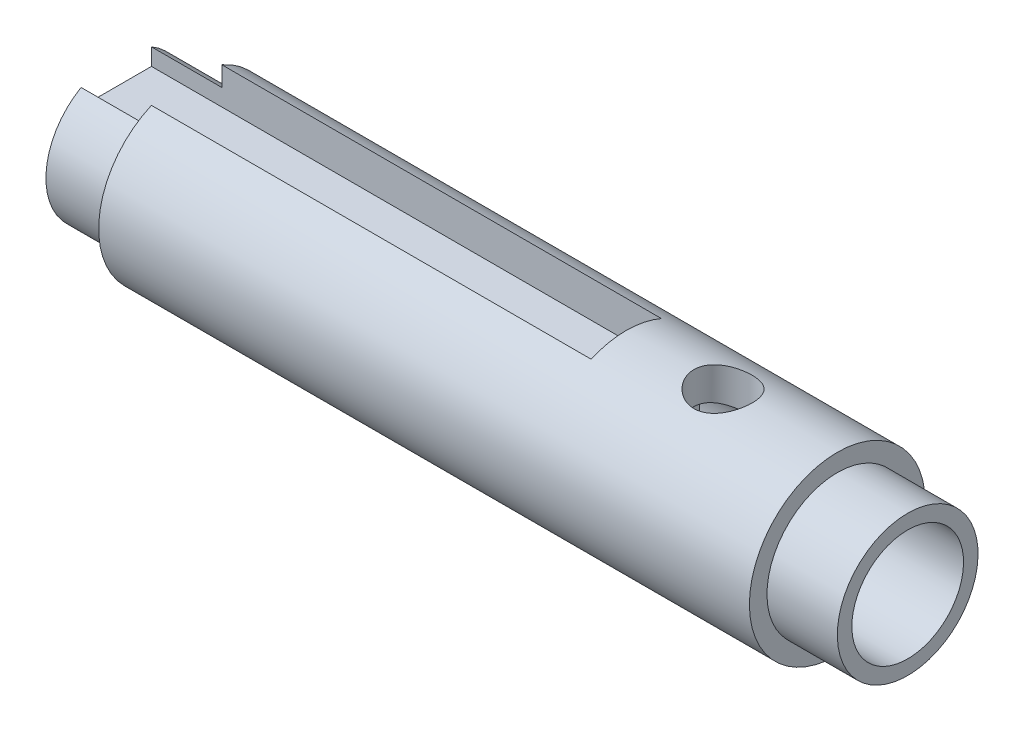
ISO-10303-21;
HEADER;
FILE_DESCRIPTION(('STEP AP214'),'2;1');
FILE_NAME('part.step','',(''),(''),'','','');
FILE_SCHEMA(('AUTOMOTIVE_DESIGN { 1 0 10303 214 1 1 1 1 }'));
ENDSEC;
DATA;
#1=APPLICATION_CONTEXT('core data for automotive mechanical design processes');
#2=APPLICATION_PROTOCOL_DEFINITION('international standard','automotive_design',2000,#1);
#3=PRODUCT_CONTEXT('',#1,'mechanical');
#4=PRODUCT('Part','Part','',(#3));
#5=PRODUCT_RELATED_PRODUCT_CATEGORY('part','',(#4));
#6=PRODUCT_DEFINITION_FORMATION('','',#4);
#7=PRODUCT_DEFINITION_CONTEXT('part definition',#1,'design');
#8=PRODUCT_DEFINITION('design','',#6,#7);
#9=PRODUCT_DEFINITION_SHAPE('','',#8);
#10=(LENGTH_UNIT() NAMED_UNIT(*) SI_UNIT(.MILLI.,.METRE.));
#11=(NAMED_UNIT(*) PLANE_ANGLE_UNIT() SI_UNIT($,.RADIAN.));
#12=(NAMED_UNIT(*) SI_UNIT($,.STERADIAN.) SOLID_ANGLE_UNIT());
#13=UNCERTAINTY_MEASURE_WITH_UNIT(LENGTH_MEASURE(1.E-05),#10,'distance_accuracy_value','');
#14=(GEOMETRIC_REPRESENTATION_CONTEXT(3) GLOBAL_UNCERTAINTY_ASSIGNED_CONTEXT((#13)) GLOBAL_UNIT_ASSIGNED_CONTEXT((#10,
#11,#12)) REPRESENTATION_CONTEXT('',''));
#15=CARTESIAN_POINT('',(0.,0.,0.));
#16=DIRECTION('',(0.,0.,1.));
#17=DIRECTION('',(1.,0.,0.));
#18=AXIS2_PLACEMENT_3D('',#15,#16,#17);
#19=CARTESIAN_POINT('',(22.5,0.,0.));
#20=DIRECTION('',(1.,0.,0.));
#21=DIRECTION('',(0.,1.,0.));
#22=AXIS2_PLACEMENT_3D('',#19,#20,#21);
#23=CYLINDRICAL_SURFACE('',#22,4.);
#24=CARTESIAN_POINT('',(18.5,0.,0.));
#25=DIRECTION('',(-1.,0.,0.));
#26=DIRECTION('',(0.,1.,0.));
#27=AXIS2_PLACEMENT_3D('',#24,#25,#26);
#28=CIRCLE('',#27,4.);
#29=CARTESIAN_POINT('',(18.5,4.00000000000001,0.));
#30=VERTEX_POINT('',#29);
#31=EDGE_CURVE('E196',#30,#30,#28,.T.);
#32=ORIENTED_EDGE('',*,*,#31,.F.);
#33=EDGE_LOOP('',(#32));
#34=FACE_BOUND('',#33,.T.);
#35=CARTESIAN_POINT('',(22.5,0.,0.));
#36=DIRECTION('',(-1.,0.,0.));
#37=DIRECTION('',(0.,1.,0.));
#38=AXIS2_PLACEMENT_3D('',#35,#36,#37);
#39=CIRCLE('',#38,4.);
#40=CARTESIAN_POINT('',(22.5,4.00000000000001,0.));
#41=VERTEX_POINT('',#40);
#42=EDGE_CURVE('E179',#41,#41,#39,.T.);
#43=ORIENTED_EDGE('',*,*,#42,.T.);
#44=EDGE_LOOP('',(#43));
#45=FACE_BOUND('',#44,.T.);
#46=ADVANCED_FACE('F42',(#34,#45),#23,.T.);
#47=CARTESIAN_POINT('',(22.5,0.,0.));
#48=DIRECTION('',(1.,0.,0.));
#49=DIRECTION('',(0.,1.,0.));
#50=AXIS2_PLACEMENT_3D('',#47,#48,#49);
#51=PLANE('',#50);
#52=CARTESIAN_POINT('',(22.5,0.,0.));
#53=DIRECTION('',(-1.,0.,0.));
#54=DIRECTION('',(0.,1.,0.));
#55=AXIS2_PLACEMENT_3D('',#52,#53,#54);
#56=CIRCLE('',#55,3.175);
#57=CARTESIAN_POINT('',(22.5,3.17500000000001,0.));
#58=VERTEX_POINT('',#57);
#59=EDGE_CURVE('E151',#58,#58,#56,.T.);
#60=ORIENTED_EDGE('',*,*,#59,.T.);
#61=EDGE_LOOP('',(#60));
#62=FACE_BOUND('',#61,.T.);
#63=ORIENTED_EDGE('',*,*,#42,.F.);
#64=EDGE_LOOP('',(#63));
#65=FACE_BOUND('',#64,.T.);
#66=ADVANCED_FACE('F214',(#62,#65),#51,.T.);
#67=CARTESIAN_POINT('',(-22.5,0.,0.));
#68=DIRECTION('',(-1.,0.,0.));
#69=DIRECTION('',(0.,-1.,0.));
#70=AXIS2_PLACEMENT_3D('',#67,#68,#69);
#71=PLANE('',#70);
#72=DIRECTION('',(0.,1.,0.));
#73=VECTOR('',#72,1.);
#74=CARTESIAN_POINT('',(-22.5,0.,-2.));
#75=LINE('',#74,#73);
#76=CARTESIAN_POINT('',(-22.5,2.49999999999999,-2.));
#77=VERTEX_POINT('',#76);
#78=CARTESIAN_POINT('',(-22.5,3.46410161513775,-2.));
#79=VERTEX_POINT('',#78);
#80=EDGE_CURVE('E139',#77,#79,#75,.T.);
#81=ORIENTED_EDGE('',*,*,#80,.T.);
#82=CARTESIAN_POINT('',(-22.5,0.,0.));
#83=DIRECTION('',(-1.,0.,0.));
#84=DIRECTION('',(0.,1.,0.));
#85=AXIS2_PLACEMENT_3D('',#82,#83,#84);
#86=CIRCLE('',#85,4.);
#87=CARTESIAN_POINT('',(-22.5,3.46410161513775,2.));
#88=VERTEX_POINT('',#87);
#89=EDGE_CURVE('E185',#79,#88,#86,.T.);
#90=ORIENTED_EDGE('',*,*,#89,.T.);
#91=DIRECTION('',(0.,1.,0.));
#92=VECTOR('',#91,1.);
#93=CARTESIAN_POINT('',(-22.5,0.,2.));
#94=LINE('',#93,#92);
#95=CARTESIAN_POINT('',(-22.5,2.49999999999999,2.));
#96=VERTEX_POINT('',#95);
#97=EDGE_CURVE('E127',#96,#88,#94,.T.);
#98=ORIENTED_EDGE('',*,*,#97,.F.);
#99=DIRECTION('',(0.,0.,-1.));
#100=VECTOR('',#99,1.);
#101=CARTESIAN_POINT('',(-22.5,2.49999999999999,0.));
#102=LINE('',#101,#100);
#103=EDGE_CURVE('E12',#96,#77,#102,.T.);
#104=ORIENTED_EDGE('',*,*,#103,.T.);
#105=EDGE_LOOP('',(#81,#90,#98,#104));
#106=FACE_BOUND('',#105,.T.);
#107=ADVANCED_FACE('F219',(#106),#71,.T.);
#108=CARTESIAN_POINT('',(22.5,0.,0.));
#109=DIRECTION('',(1.,0.,0.));
#110=DIRECTION('',(0.,1.,0.));
#111=AXIS2_PLACEMENT_3D('',#108,#109,#110);
#112=CYLINDRICAL_SURFACE('',#111,4.);
#113=DIRECTION('',(1.,0.,0.));
#114=VECTOR('',#113,1.);
#115=CARTESIAN_POINT('',(22.5,3.46410161513776,-2.));
#116=LINE('',#115,#114);
#117=CARTESIAN_POINT('',(-18.5,3.46410161513775,-2.));
#118=VERTEX_POINT('',#117);
#119=EDGE_CURVE('E62',#79,#118,#116,.T.);
#120=ORIENTED_EDGE('',*,*,#119,.T.);
#121=CARTESIAN_POINT('',(-18.5,0.,0.));
#122=DIRECTION('',(-1.,0.,0.));
#123=DIRECTION('',(0.,1.,0.));
#124=AXIS2_PLACEMENT_3D('',#121,#122,#123);
#125=CIRCLE('',#124,4.);
#126=CARTESIAN_POINT('',(-18.5,3.46410161513775,2.));
#127=VERTEX_POINT('',#126);
#128=EDGE_CURVE('E189',#118,#127,#125,.T.);
#129=ORIENTED_EDGE('',*,*,#128,.T.);
#130=DIRECTION('',(1.,0.,0.));
#131=VECTOR('',#130,1.);
#132=CARTESIAN_POINT('',(22.5,3.46410161513776,2.));
#133=LINE('',#132,#131);
#134=EDGE_CURVE('E124',#88,#127,#133,.T.);
#135=ORIENTED_EDGE('',*,*,#134,.F.);
#136=ORIENTED_EDGE('',*,*,#89,.F.);
#137=EDGE_LOOP('',(#120,#129,#135,#136));
#138=FACE_BOUND('',#137,.T.);
#139=ADVANCED_FACE('F229',(#138),#112,.T.);
#140=CARTESIAN_POINT('',(-18.5,3.99999999999999,0.));
#141=DIRECTION('',(-1.,0.,0.));
#142=DIRECTION('',(0.,-1.,0.));
#143=AXIS2_PLACEMENT_3D('',#140,#141,#142);
#144=PLANE('',#143);
#145=DIRECTION('',(0.,1.,0.));
#146=VECTOR('',#145,1.);
#147=CARTESIAN_POINT('',(-18.5,3.99999999999999,-2.));
#148=LINE('',#147,#146);
#149=CARTESIAN_POINT('',(-18.5,4.58257569495583,-2.));
#150=VERTEX_POINT('',#149);
#151=EDGE_CURVE('E140',#118,#150,#148,.T.);
#152=ORIENTED_EDGE('',*,*,#151,.T.);
#153=CARTESIAN_POINT('',(-18.5,0.,0.));
#154=DIRECTION('',(-1.,0.,0.));
#155=DIRECTION('',(0.,1.,0.));
#156=AXIS2_PLACEMENT_3D('',#153,#154,#155);
#157=CIRCLE('',#156,5.);
#158=CARTESIAN_POINT('',(-18.5,4.58257569495583,2.));
#159=VERTEX_POINT('',#158);
#160=EDGE_CURVE('E191',#150,#159,#157,.T.);
#161=ORIENTED_EDGE('',*,*,#160,.T.);
#162=DIRECTION('',(0.,1.,0.));
#163=VECTOR('',#162,1.);
#164=CARTESIAN_POINT('',(-18.5,3.99999999999999,2.));
#165=LINE('',#164,#163);
#166=EDGE_CURVE('E107',#127,#159,#165,.T.);
#167=ORIENTED_EDGE('',*,*,#166,.F.);
#168=ORIENTED_EDGE('',*,*,#128,.F.);
#169=EDGE_LOOP('',(#152,#161,#167,#168));
#170=FACE_BOUND('',#169,.T.);
#171=ADVANCED_FACE('F171',(#170),#144,.T.);
#172=CARTESIAN_POINT('',(22.5,0.,0.));
#173=DIRECTION('',(1.,0.,0.));
#174=DIRECTION('',(0.,1.,0.));
#175=AXIS2_PLACEMENT_3D('',#172,#173,#174);
#176=CYLINDRICAL_SURFACE('',#175,5.);
#177=DIRECTION('',(1.,0.,0.));
#178=VECTOR('',#177,1.);
#179=CARTESIAN_POINT('',(22.5,4.58257569495585,-2.));
#180=LINE('',#179,#178);
#181=CARTESIAN_POINT('',(6.5,4.58257569495584,-2.));
#182=VERTEX_POINT('',#181);
#183=EDGE_CURVE('E48',#150,#182,#180,.T.);
#184=ORIENTED_EDGE('',*,*,#183,.T.);
#185=CARTESIAN_POINT('',(6.5,0.,0.));
#186=DIRECTION('',(1.,0.,0.));
#187=DIRECTION('',(0.,-1.,0.));
#188=AXIS2_PLACEMENT_3D('',#185,#186,#187);
#189=CIRCLE('',#188,5.);
#190=CARTESIAN_POINT('',(6.5,4.58257569495584,2.));
#191=VERTEX_POINT('',#190);
#192=EDGE_CURVE('E97',#182,#191,#189,.T.);
#193=ORIENTED_EDGE('',*,*,#192,.T.);
#194=DIRECTION('',(1.,0.,0.));
#195=VECTOR('',#194,1.);
#196=CARTESIAN_POINT('',(22.5,4.58257569495585,2.));
#197=LINE('',#196,#195);
#198=EDGE_CURVE('E104',#159,#191,#197,.T.);
#199=ORIENTED_EDGE('',*,*,#198,.F.);
#200=ORIENTED_EDGE('',*,*,#160,.F.);
#201=EDGE_LOOP('',(#184,#193,#199,#200));
#202=FACE_BOUND('',#201,.T.);
#203=CARTESIAN_POINT('',(10.35,5.,0.));
#204=CARTESIAN_POINT('',(10.3499997574856,5.00000012564882,-0.0900803323989867));
#205=CARTESIAN_POINT('',(10.357400837485,4.99754312617874,-0.180159574077353));
#206=CARTESIAN_POINT('',(10.3867211495276,4.98798348171153,-0.357667875169257));
#207=CARTESIAN_POINT('',(10.4086421758353,4.98088026257135,-0.44509660565632));
#208=CARTESIAN_POINT('',(10.4661713123883,4.96280068143201,-0.614719075952392));
#209=CARTESIAN_POINT('',(10.501756817014,4.95183071876684,-0.696921201899964));
#210=CARTESIAN_POINT('',(10.5855035726919,4.92713947248839,-0.854190645874481));
#211=CARTESIAN_POINT('',(10.6336672263034,4.91341766335966,-0.929256597076052));
#212=CARTESIAN_POINT('',(10.7429248230714,4.88414667976015,-1.07267700256014));
#213=CARTESIAN_POINT('',(10.8043700182742,4.86855436886588,-1.140755021368));
#214=CARTESIAN_POINT('',(10.9376995139198,4.83753907804007,-1.26585047260417));
#215=CARTESIAN_POINT('',(11.0095860466927,4.8221161350793,-1.32286553369749));
#216=CARTESIAN_POINT('',(11.1642306123795,4.79271313173334,-1.42578155512387));
#217=CARTESIAN_POINT('',(11.2472372375852,4.77878574898836,-1.47132547146369));
#218=CARTESIAN_POINT('',(11.4202656308341,4.75460549483772,-1.5476895000705));
#219=CARTESIAN_POINT('',(11.5102852973523,4.74435152777497,-1.57851400356115));
#220=CARTESIAN_POINT('',(11.6916448290813,4.72913282635101,-1.62353134991423));
#221=CARTESIAN_POINT('',(11.7828421633256,4.72400412235767,-1.6382413417332));
#222=CARTESIAN_POINT('',(11.966543612694,4.7191313464795,-1.65222861163855));
#223=CARTESIAN_POINT('',(12.0590473250677,4.71938564975367,-1.65151054662635));
#224=CARTESIAN_POINT('',(12.2383472023923,4.72510629107569,-1.63506410098719));
#225=CARTESIAN_POINT('',(12.3252137352388,4.73033928879682,-1.62000769651632));
#226=CARTESIAN_POINT('',(12.4951109061667,4.74504632523488,-1.57640708934977));
#227=CARTESIAN_POINT('',(12.5781410922653,4.75452086227439,-1.54786130181506));
#228=CARTESIAN_POINT('',(12.7395474399946,4.77681173941001,-1.47764674240872));
#229=CARTESIAN_POINT('',(12.8178288502253,4.78967871947684,-1.43577693123635));
#230=CARTESIAN_POINT('',(12.9664683623015,4.81728315916033,-1.34024242388314));
#231=CARTESIAN_POINT('',(13.0368242036941,4.83202114987191,-1.28657437554158));
#232=CARTESIAN_POINT('',(13.1713952274102,4.86262798242567,-1.16572801734404));
#233=CARTESIAN_POINT('',(13.2351128786431,4.87851612594017,-1.09799945388895));
#234=CARTESIAN_POINT('',(13.3504141782392,4.9089733458653,-0.952622363558083));
#235=CARTESIAN_POINT('',(13.401996708755,4.92354230068064,-0.874972923819716));
#236=CARTESIAN_POINT('',(13.491953516837,4.9499042925994,-0.710918878360193));
#237=CARTESIAN_POINT('',(13.530196897213,4.96166947936115,-0.624437715003006));
#238=CARTESIAN_POINT('',(13.5914397196063,4.98089634514735,-0.445788820584336));
#239=CARTESIAN_POINT('',(13.6144443470641,4.98835948795835,-0.353623035566634));
#240=CARTESIAN_POINT('',(13.6436807853833,4.9979000192954,-0.17043493694281));
#241=CARTESIAN_POINT('',(13.6505850936395,5.0001932084094,-0.0795310449403316));
#242=CARTESIAN_POINT('',(13.6493373673087,4.99978120399321,0.10215299707419));
#243=CARTESIAN_POINT('',(13.6411878171332,4.99707683523428,0.19293316503069));
#244=CARTESIAN_POINT('',(13.6105971738171,4.98711592890817,0.369117276094976));
#245=CARTESIAN_POINT('',(13.5885667899855,4.97999029806496,0.454600657078433));
#246=CARTESIAN_POINT('',(13.5313513084882,4.96203610216641,0.620625393385987));
#247=CARTESIAN_POINT('',(13.4961645401181,4.9512070668376,0.701166119538831));
#248=CARTESIAN_POINT('',(13.4126189804476,4.92659738190257,0.857353583850655));
#249=CARTESIAN_POINT('',(13.3639413852355,4.91274728599484,0.932818538636807));
#250=CARTESIAN_POINT('',(13.2551717652041,4.8836680633903,1.07472879779132));
#251=CARTESIAN_POINT('',(13.195076316326,4.86843852373584,1.14117138619964));
#252=CARTESIAN_POINT('',(13.062013827308,4.83745909847492,1.26622547851876));
#253=CARTESIAN_POINT('',(12.9885931330763,4.82171620160003,1.32435715949936));
#254=CARTESIAN_POINT('',(12.8327001451063,4.79218567046633,1.42753142742357));
#255=CARTESIAN_POINT('',(12.7502278168408,4.77839804366633,1.47257396443646));
#256=CARTESIAN_POINT('',(12.5785745160417,4.75447746870334,1.54806908435207));
#257=CARTESIAN_POINT('',(12.4894100140228,4.74433588191366,1.57855621066784));
#258=CARTESIAN_POINT('',(12.3068020979204,4.728992662468,1.62395003915295));
#259=CARTESIAN_POINT('',(12.213360579788,4.72378886275909,1.63886357641239));
#260=CARTESIAN_POINT('',(12.0299145750871,4.71915352744858,1.65216049477083));
#261=CARTESIAN_POINT('',(11.9399740636218,4.71944442417867,1.6513387236508));
#262=CARTESIAN_POINT('',(11.7615834004099,4.72508139490563,1.63513842564513));
#263=CARTESIAN_POINT('',(11.6731331635849,4.7304271793221,1.61976073262755));
#264=CARTESIAN_POINT('',(11.5018358628154,4.74536693764462,1.57544291875231));
#265=CARTESIAN_POINT('',(11.4189160278425,4.75488165289365,1.54675527092969));
#266=CARTESIAN_POINT('',(11.2590025073374,4.77705935615134,1.47683540940045));
#267=CARTESIAN_POINT('',(11.1820101250481,4.78972303393434,1.43560044678476));
#268=CARTESIAN_POINT('',(11.0325565456336,4.81744939348764,1.33969084183065));
#269=CARTESIAN_POINT('',(10.9604315889302,4.8325917044349,1.28451538865981));
#270=CARTESIAN_POINT('',(10.826207419325,4.86323043063064,1.16314331347536));
#271=CARTESIAN_POINT('',(10.7641110248733,4.87872694403302,1.09694360376003));
#272=CARTESIAN_POINT('',(10.6493366681908,4.90903317548774,0.952387676734107));
#273=CARTESIAN_POINT('',(10.5971049783148,4.92379458911327,0.873665758138171));
#274=CARTESIAN_POINT('',(10.5066751421022,4.95031750248797,0.708077082051268));
#275=CARTESIAN_POINT('',(10.4684730828886,4.96207983840249,0.621212604024479));
#276=CARTESIAN_POINT('',(10.4089869849695,4.98076953032462,0.446386541872211));
#277=CARTESIAN_POINT('',(10.386936477516,4.98791371763215,0.358709155083951));
#278=CARTESIAN_POINT('',(10.3574450279568,4.99752827480817,0.180687007883427));
#279=CARTESIAN_POINT('',(10.3500002432214,4.99999987398486,0.0903429553968472));
#280=CARTESIAN_POINT('',(10.35,5.,0.));
#281=B_SPLINE_CURVE_WITH_KNOTS('',3,(#203,#204,#205,#206,#207,#208,#209,#210,#211,#212,#213,
#214,#215,#216,#217,#218,#219,#220,#221,#222,#223,#224,#225,#226,#227,#228,#229,#230,#231,#232,
#233,#234,#235,#236,#237,#238,#239,#240,#241,#242,#243,#244,#245,#246,#247,#248,#249,#250,#251,
#252,#253,#254,#255,#256,#257,#258,#259,#260,#261,#262,#263,#264,#265,#266,#267,#268,#269,#270,
#271,#272,#273,#274,#275,#276,#277,#278,#279,#280),.UNSPECIFIED.,.T.,.F.,(4,2,2,2,2,2,2,2,2,2,2,
2,2,2,2,2,2,2,2,2,2,2,2,2,2,2,2,2,2,2,2,2,2,2,2,2,2,2,4),(0.,0.269908604132499,
0.539850567737246,0.809347867689092,1.07889668217443,1.35671215765951,1.63458711701568,
1.92026489148116,2.20585738673401,2.48198869358466,2.75803665240172,3.02175295330503,
3.28550024538371,3.55343249441285,3.82144096800203,4.10314526837294,4.38487550826385,
4.66929734218007,4.95362234329173,5.22584041060145,5.49801355645391,5.76248915124946,
6.02699834271653,6.29838751507403,6.56985820217366,6.85340472718152,7.13695233381084,
7.41982362841784,7.70257072144069,7.97107468624607,8.23956327014093,8.50315503612408,
8.76680459233089,9.04176838412559,9.31680931840235,9.60227659952694,9.88766420298742,
10.1584309528124,10.4291264568694),.UNSPECIFIED.);
#282=CARTESIAN_POINT('',(10.35,5.,0.));
#283=VERTEX_POINT('',#282);
#284=EDGE_CURVE('E111',#283,#283,#281,.T.);
#285=ORIENTED_EDGE('',*,*,#284,.T.);
#286=EDGE_LOOP('',(#285));
#287=FACE_BOUND('',#286,.T.);
#288=CARTESIAN_POINT('',(18.5,0.,0.));
#289=DIRECTION('',(-1.,0.,0.));
#290=DIRECTION('',(0.,1.,0.));
#291=AXIS2_PLACEMENT_3D('',#288,#289,#290);
#292=CIRCLE('',#291,5.);
#293=CARTESIAN_POINT('',(18.5,5.00000000000001,0.));
#294=VERTEX_POINT('',#293);
#295=EDGE_CURVE('E193',#294,#294,#292,.T.);
#296=ORIENTED_EDGE('',*,*,#295,.T.);
#297=EDGE_LOOP('',(#296));
#298=FACE_BOUND('',#297,.T.);
#299=ADVANCED_FACE('F113',(#202,#287,#298),#176,.T.);
#300=CARTESIAN_POINT('',(18.5,4.00000000000001,0.));
#301=DIRECTION('',(1.,0.,0.));
#302=DIRECTION('',(0.,1.,0.));
#303=AXIS2_PLACEMENT_3D('',#300,#301,#302);
#304=PLANE('',#303);
#305=ORIENTED_EDGE('',*,*,#295,.F.);
#306=EDGE_LOOP('',(#305));
#307=FACE_BOUND('',#306,.T.);
#308=ORIENTED_EDGE('',*,*,#31,.T.);
#309=EDGE_LOOP('',(#308));
#310=FACE_BOUND('',#309,.T.);
#311=ADVANCED_FACE('F163',(#307,#310),#304,.T.);
#312=CARTESIAN_POINT('',(7.5,0.,0.));
#313=DIRECTION('',(1.,0.,0.));
#314=DIRECTION('',(0.,1.,0.));
#315=AXIS2_PLACEMENT_3D('',#312,#313,#314);
#316=CYLINDRICAL_SURFACE('',#315,3.175);
#317=CARTESIAN_POINT('',(10.35,3.175,0.));
#318=CARTESIAN_POINT('',(10.3500056079565,3.17499505072987,-0.0863288456326064));
#319=CARTESIAN_POINT('',(10.3568147744306,3.17144199402365,-0.172748082059083));
#320=CARTESIAN_POINT('',(10.3837377897262,3.15757827840902,-0.34300620977565));
#321=CARTESIAN_POINT('',(10.4038741979,3.14725616161683,-0.426840473151071));
#322=CARTESIAN_POINT('',(10.4564381177141,3.12092848257844,-0.589211374045223));
#323=CARTESIAN_POINT('',(10.4888166585286,3.10494558044068,-0.667767668913881));
#324=CARTESIAN_POINT('',(10.5646778196976,3.06874009265734,-0.818201782224421));
#325=CARTESIAN_POINT('',(10.6081601218172,3.04851762852102,-0.890079791986143));
#326=CARTESIAN_POINT('',(10.7081371657511,3.00414727626075,-1.0302764851221));
#327=CARTESIAN_POINT('',(10.7652853375622,2.97983121925871,-1.09807511856644));
#328=CARTESIAN_POINT('',(10.8895547069123,2.93052200356347,-1.22361064753918));
#329=CARTESIAN_POINT('',(10.9566840795454,2.90552830369848,-1.28133921015419));
#330=CARTESIAN_POINT('',(11.105870513951,2.85521488514068,-1.39005780085114));
#331=CARTESIAN_POINT('',(11.1887130123632,2.83004983246423,-1.44005038752232));
#332=CARTESIAN_POINT('',(11.3630554315894,2.78509705834675,-1.52518575600505));
#333=CARTESIAN_POINT('',(11.4545487790751,2.76530529759573,-1.56033970368239));
#334=CARTESIAN_POINT('',(11.6378950583068,2.73525125469313,-1.61241612807522));
#335=CARTESIAN_POINT('',(11.7293783004104,2.72447683690935,-1.63032870241774));
#336=CARTESIAN_POINT('',(11.9146315463125,2.7123631367979,-1.65041375344092));
#337=CARTESIAN_POINT('',(12.0083988180116,2.71101308866366,-1.65260419018252));
#338=CARTESIAN_POINT('',(12.1822454502874,2.71749559707493,-1.64190642931167));
#339=CARTESIAN_POINT('',(12.2625003964916,2.7241416367145,-1.63096705490198));
#340=CARTESIAN_POINT('',(12.4198142482997,2.74376959937903,-1.59772412376283));
#341=CARTESIAN_POINT('',(12.4968719770454,2.75675383336014,-1.57541642192005));
#342=CARTESIAN_POINT('',(12.6478000487477,2.78786252488853,-1.51969740066464));
#343=CARTESIAN_POINT('',(12.7215566462365,2.80609811745903,-1.48604299006153));
#344=CARTESIAN_POINT('',(12.8627420456755,2.84567172377063,-1.40877957111467));
#345=CARTESIAN_POINT('',(12.9301679927661,2.86701112624824,-1.36516610178818));
#346=CARTESIAN_POINT('',(13.066605117625,2.91395184841571,-1.26219363296329));
#347=CARTESIAN_POINT('',(13.1345433737606,2.93973419319173,-1.20149067627236));
#348=CARTESIAN_POINT('',(13.259743599097,2.99028352285429,-1.06949807216656));
#349=CARTESIAN_POINT('',(13.31699965836,3.0150499398017,-0.99820260338082));
#350=CARTESIAN_POINT('',(13.4221395945346,3.06239833689467,-0.842215729793853));
#351=CARTESIAN_POINT('',(13.4693521562786,3.08479068244345,-0.757009480815105));
#352=CARTESIAN_POINT('',(13.5483713504233,3.12320055261165,-0.578409880932615));
#353=CARTESIAN_POINT('',(13.5801911168124,3.13922350985849,-0.485023590349087));
#354=CARTESIAN_POINT('',(13.6247382765902,3.1618929684137,-0.301424850405785));
#355=CARTESIAN_POINT('',(13.6388868608851,3.16923442880762,-0.211644081258463));
#356=CARTESIAN_POINT('',(13.6522026723972,3.17613950193604,-0.0306980246370349));
#357=CARTESIAN_POINT('',(13.6513778835395,3.17570725967355,0.0604664990981065));
#358=CARTESIAN_POINT('',(13.635527779133,3.16749754931548,0.233316980710388));
#359=CARTESIAN_POINT('',(13.6217178218068,3.16034876631346,0.3151489623336));
#360=CARTESIAN_POINT('',(13.5822527097377,3.14028034254955,0.475150242718686));
#361=CARTESIAN_POINT('',(13.5565962936485,3.12736008727764,0.553319150480023));
#362=CARTESIAN_POINT('',(13.4935813836596,3.09647180446975,0.706212939280996));
#363=CARTESIAN_POINT('',(13.4559294015846,3.07837849351248,0.780790630451235));
#364=CARTESIAN_POINT('',(13.3703371123435,3.03883348654069,0.922798990984224));
#365=CARTESIAN_POINT('',(13.3223926143017,3.01738042347771,0.990226732294096));
#366=CARTESIAN_POINT('',(13.2118473363396,2.97051129977894,1.12346696056841));
#367=CARTESIAN_POINT('',(13.1482411793532,2.94491509095218,1.18838319198266));
#368=CARTESIAN_POINT('',(13.0111026504004,2.89420006415324,1.30705950166707));
#369=CARTESIAN_POINT('',(12.9375621273933,2.86908165772535,1.36081032595766));
#370=CARTESIAN_POINT('',(12.777217683471,2.82064166280039,1.45868586616518));
#371=CARTESIAN_POINT('',(12.6898860180691,2.79751477508171,1.5020513398829));
#372=CARTESIAN_POINT('',(12.5075999661366,2.75824552844262,1.57301408971573));
#373=CARTESIAN_POINT('',(12.4126562866029,2.74209355614627,1.60063308579739));
#374=CARTESIAN_POINT('',(12.2277148079658,2.72073397702698,1.6366526208553));
#375=CARTESIAN_POINT('',(12.138140282623,2.71461115428773,1.6466673965615));
#376=CARTESIAN_POINT('',(11.9584177654956,2.71142086136596,1.65191965806436));
#377=CARTESIAN_POINT('',(11.8682701267278,2.71434827131427,1.64716549888903));
#378=CARTESIAN_POINT('',(11.7005004282466,2.72792811118478,1.62455190222244));
#379=CARTESIAN_POINT('',(11.6225937373491,2.73769263356809,1.60819619302194));
#380=CARTESIAN_POINT('',(11.4707488647697,2.76271895398112,1.56481064042944));
#381=CARTESIAN_POINT('',(11.3968120684376,2.77798265688342,1.53777709800759));
#382=CARTESIAN_POINT('',(11.2495666977159,2.81350803687632,1.47183030022051));
#383=CARTESIAN_POINT('',(11.1766224854284,2.83403332991857,1.43225007776854));
#384=CARTESIAN_POINT('',(11.0379248413719,2.8773886681579,1.34302626148151));
#385=CARTESIAN_POINT('',(10.9721752932031,2.90021994543856,1.29337727349087));
#386=CARTESIAN_POINT('',(10.8404877116796,2.9492999139497,1.17758996129411));
#387=CARTESIAN_POINT('',(10.7757217026665,2.97559398358101,1.1101305728642));
#388=CARTESIAN_POINT('',(10.6581116196618,3.02588178787174,0.964667870386815));
#389=CARTESIAN_POINT('',(10.6052746694978,3.0498741430953,0.886658300178438));
#390=CARTESIAN_POINT('',(10.5124482542983,3.09341655888198,0.720351736157363));
#391=CARTESIAN_POINT('',(10.4726864726555,3.11288631790362,0.631905543674001));
#392=CARTESIAN_POINT('',(10.4091365260247,3.14455148561551,0.448359444233514));
#393=CARTESIAN_POINT('',(10.3853044933178,3.15676686115213,0.353278613099311));
#394=CARTESIAN_POINT('',(10.3634069749133,3.16804947609633,0.214273226426304));
#395=CARTESIAN_POINT('',(10.3583877860301,3.17064787670482,0.171623628363415));
#396=CARTESIAN_POINT('',(10.3516828634887,3.17412439117156,0.0859901694433891));
#397=CARTESIAN_POINT('',(10.3499972062934,3.17500246556988,0.043006300941636));
#398=CARTESIAN_POINT('',(10.35,3.175,0.));
#399=B_SPLINE_CURVE_WITH_KNOTS('',3,(#317,#318,#319,#320,#321,#322,#323,#324,#325,#326,#327,
#328,#329,#330,#331,#332,#333,#334,#335,#336,#337,#338,#339,#340,#341,#342,#343,#344,#345,#346,
#347,#348,#349,#350,#351,#352,#353,#354,#355,#356,#357,#358,#359,#360,#361,#362,#363,#364,#365,
#366,#367,#368,#369,#370,#371,#372,#373,#374,#375,#376,#377,#378,#379,#380,#381,#382,#383,#384,
#385,#386,#387,#388,#389,#390,#391,#392,#393,#394,#395,#396,#397,#398),.UNSPECIFIED.,.T.,.F.,(4,
2,2,2,2,2,2,2,2,2,2,2,2,2,2,2,2,2,2,2,2,2,2,2,2,2,2,2,2,2,2,2,2,2,2,2,2,2,2,2,4),(0.,
0.258812639959759,0.51806450280917,0.776290097153166,1.03450829155513,1.30920871118935,
1.58413537617049,1.88255645928857,2.18075258270928,2.46057054013292,2.74006879875385,
2.98273863505733,3.22549701687856,3.47382700917836,3.72226845543168,4.00510588014549,
4.28809932394922,4.58634272186329,4.88433119110175,5.15637271535242,5.42826918909886,
5.67700982508987,5.92577695173242,6.1811701012791,6.43666743895274,6.71871967957098,
7.00100476277757,7.30001876037766,7.59861930772336,7.86804172496084,8.13731175329199,
8.37687413371432,8.61651957655826,8.87200077334421,9.12761920276589,9.41773424708266,
9.70802208750468,10.0031258310574,10.2974135255293,10.4263428411207,10.5552751139901),.UNSPECIFIED.);
#400=CARTESIAN_POINT('',(10.35,3.175,0.));
#401=VERTEX_POINT('',#400);
#402=EDGE_CURVE('E143',#401,#401,#399,.T.);
#403=ORIENTED_EDGE('',*,*,#402,.F.);
#404=EDGE_LOOP('',(#403));
#405=FACE_BOUND('',#404,.T.);
#406=CARTESIAN_POINT('',(7.5,0.,0.));
#407=DIRECTION('',(-1.,0.,0.));
#408=DIRECTION('',(0.,1.,0.));
#409=AXIS2_PLACEMENT_3D('',#406,#407,#408);
#410=CIRCLE('',#409,3.175);
#411=CARTESIAN_POINT('',(7.5,3.175,0.));
#412=VERTEX_POINT('',#411);
#413=EDGE_CURVE('E152',#412,#412,#410,.T.);
#414=ORIENTED_EDGE('',*,*,#413,.T.);
#415=EDGE_LOOP('',(#414));
#416=FACE_BOUND('',#415,.T.);
#417=ORIENTED_EDGE('',*,*,#59,.F.);
#418=EDGE_LOOP('',(#417));
#419=FACE_BOUND('',#418,.T.);
#420=ADVANCED_FACE('F158',(#405,#416,#419),#316,.F.);
#421=CARTESIAN_POINT('',(7.5,0.,0.));
#422=DIRECTION('',(1.,0.,0.));
#423=DIRECTION('',(0.,1.,0.));
#424=AXIS2_PLACEMENT_3D('',#421,#422,#423);
#425=PLANE('',#424);
#426=ORIENTED_EDGE('',*,*,#413,.F.);
#427=EDGE_LOOP('',(#426));
#428=FACE_BOUND('',#427,.T.);
#429=ADVANCED_FACE('F162',(#428),#425,.T.);
#430=CARTESIAN_POINT('',(12.,5.,0.));
#431=DIRECTION('',(0.,1.,0.));
#432=DIRECTION('',(0.,0.,-1.));
#433=AXIS2_PLACEMENT_3D('',#430,#431,#432);
#434=CYLINDRICAL_SURFACE('',#433,1.64999999999999);
#435=ORIENTED_EDGE('',*,*,#284,.F.);
#436=EDGE_LOOP('',(#435));
#437=FACE_BOUND('',#436,.T.);
#438=ORIENTED_EDGE('',*,*,#402,.T.);
#439=EDGE_LOOP('',(#438));
#440=FACE_BOUND('',#439,.T.);
#441=ADVANCED_FACE('F154',(#437,#440),#434,.F.);
#442=CARTESIAN_POINT('',(-43.5,0.,-2.));
#443=DIRECTION('',(0.,0.,-1.));
#444=DIRECTION('',(0.,-1.,0.));
#445=AXIS2_PLACEMENT_3D('',#442,#443,#444);
#446=PLANE('',#445);
#447=ORIENTED_EDGE('',*,*,#80,.F.);
#448=DIRECTION('',(1.,0.,0.));
#449=VECTOR('',#448,1.);
#450=CARTESIAN_POINT('',(-43.5,2.49999999999999,-2.));
#451=LINE('',#450,#449);
#452=CARTESIAN_POINT('',(6.5,2.5,-2.));
#453=VERTEX_POINT('',#452);
#454=EDGE_CURVE('E119',#77,#453,#451,.T.);
#455=ORIENTED_EDGE('',*,*,#454,.T.);
#456=DIRECTION('',(0.,-1.,0.));
#457=VECTOR('',#456,1.);
#458=CARTESIAN_POINT('',(6.5,0.,-2.));
#459=LINE('',#458,#457);
#460=EDGE_CURVE('E55',#182,#453,#459,.T.);
#461=ORIENTED_EDGE('',*,*,#460,.F.);
#462=ORIENTED_EDGE('',*,*,#183,.F.);
#463=ORIENTED_EDGE('',*,*,#151,.F.);
#464=ORIENTED_EDGE('',*,*,#119,.F.);
#465=EDGE_LOOP('',(#447,#455,#461,#462,#463,#464));
#466=FACE_BOUND('',#465,.T.);
#467=ADVANCED_FACE('F211',(#466),#446,.F.);
#468=CARTESIAN_POINT('',(-43.5,0.,2.));
#469=DIRECTION('',(0.,0.,-1.));
#470=DIRECTION('',(0.,-1.,0.));
#471=AXIS2_PLACEMENT_3D('',#468,#469,#470);
#472=PLANE('',#471);
#473=DIRECTION('',(1.,0.,0.));
#474=VECTOR('',#473,1.);
#475=CARTESIAN_POINT('',(-43.5,2.49999999999999,2.));
#476=LINE('',#475,#474);
#477=CARTESIAN_POINT('',(6.5,2.5,2.));
#478=VERTEX_POINT('',#477);
#479=EDGE_CURVE('E121',#96,#478,#476,.T.);
#480=ORIENTED_EDGE('',*,*,#479,.F.);
#481=ORIENTED_EDGE('',*,*,#97,.T.);
#482=ORIENTED_EDGE('',*,*,#134,.T.);
#483=ORIENTED_EDGE('',*,*,#166,.T.);
#484=ORIENTED_EDGE('',*,*,#198,.T.);
#485=DIRECTION('',(0.,-1.,0.));
#486=VECTOR('',#485,1.);
#487=CARTESIAN_POINT('',(6.5,0.,2.));
#488=LINE('',#487,#486);
#489=EDGE_CURVE('E93',#191,#478,#488,.T.);
#490=ORIENTED_EDGE('',*,*,#489,.T.);
#491=EDGE_LOOP('',(#480,#481,#482,#483,#484,#490));
#492=FACE_BOUND('',#491,.T.);
#493=ADVANCED_FACE('F105',(#492),#472,.T.);
#494=CARTESIAN_POINT('',(-43.5,2.49999999999999,0.));
#495=DIRECTION('',(0.,-1.,0.));
#496=DIRECTION('',(1.,0.,0.));
#497=AXIS2_PLACEMENT_3D('',#494,#495,#496);
#498=PLANE('',#497);
#499=ORIENTED_EDGE('',*,*,#103,.F.);
#500=ORIENTED_EDGE('',*,*,#479,.T.);
#501=DIRECTION('',(0.,0.,1.));
#502=VECTOR('',#501,1.);
#503=CARTESIAN_POINT('',(6.5,2.5,0.));
#504=LINE('',#503,#502);
#505=EDGE_CURVE('E99',#453,#478,#504,.T.);
#506=ORIENTED_EDGE('',*,*,#505,.F.);
#507=ORIENTED_EDGE('',*,*,#454,.F.);
#508=EDGE_LOOP('',(#499,#500,#506,#507));
#509=FACE_BOUND('',#508,.T.);
#510=ADVANCED_FACE('F243',(#509),#498,.F.);
#511=CARTESIAN_POINT('',(6.5,0.,0.));
#512=DIRECTION('',(-1.,0.,0.));
#513=DIRECTION('',(0.,-1.,0.));
#514=AXIS2_PLACEMENT_3D('',#511,#512,#513);
#515=PLANE('',#514);
#516=ORIENTED_EDGE('',*,*,#460,.T.);
#517=ORIENTED_EDGE('',*,*,#505,.T.);
#518=ORIENTED_EDGE('',*,*,#489,.F.);
#519=ORIENTED_EDGE('',*,*,#192,.F.);
#520=EDGE_LOOP('',(#516,#517,#518,#519));
#521=FACE_BOUND('',#520,.T.);
#522=ADVANCED_FACE('F95',(#521),#515,.T.);
#523=CLOSED_SHELL('',(#46,#66,#107,#139,#171,#299,#311,#420,#429,#441,#467,#493,#510,#522));
#524=MANIFOLD_SOLID_BREP('B2',#523);
#525=ADVANCED_BREP_SHAPE_REPRESENTATION('',(#18,#524),#14);
#526=SHAPE_DEFINITION_REPRESENTATION(#9,#525);
ENDSEC;
END-ISO-10303-21;
